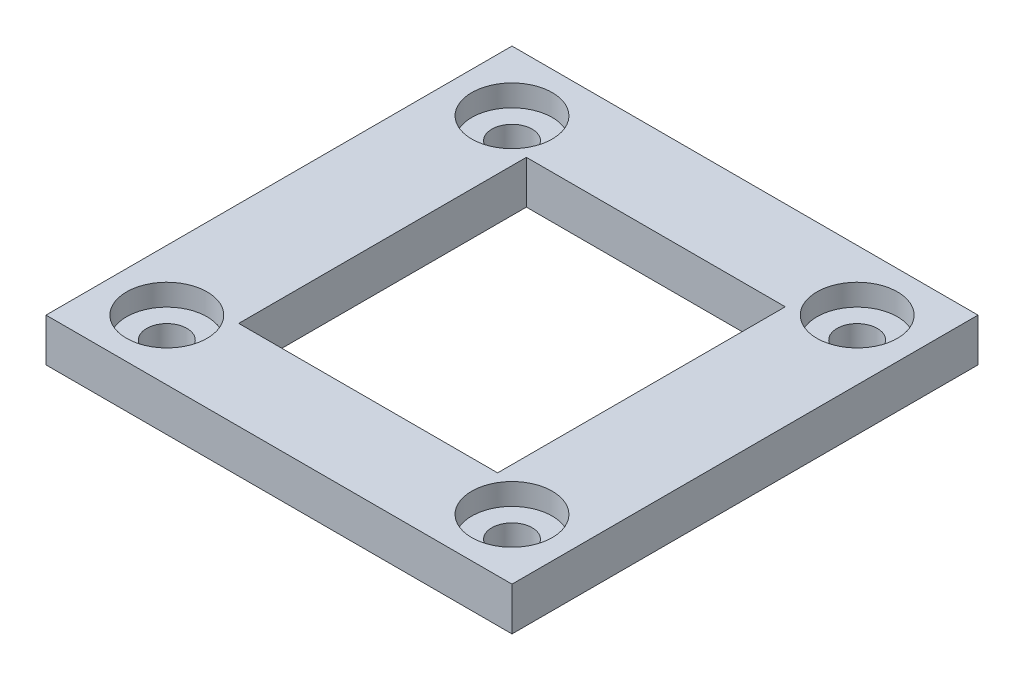
ISO-10303-21;
HEADER;
FILE_DESCRIPTION(('STEP AP214'),'2;1');
FILE_NAME('part.step','',(''),(''),'','','');
FILE_SCHEMA(('AUTOMOTIVE_DESIGN { 1 0 10303 214 1 1 1 1 }'));
ENDSEC;
DATA;
#1=APPLICATION_CONTEXT('core data for automotive mechanical design processes');
#2=APPLICATION_PROTOCOL_DEFINITION('international standard','automotive_design',2000,#1);
#3=PRODUCT_CONTEXT('',#1,'mechanical');
#4=PRODUCT('Part','Part','',(#3));
#5=PRODUCT_RELATED_PRODUCT_CATEGORY('part','',(#4));
#6=PRODUCT_DEFINITION_FORMATION('','',#4);
#7=PRODUCT_DEFINITION_CONTEXT('part definition',#1,'design');
#8=PRODUCT_DEFINITION('design','',#6,#7);
#9=PRODUCT_DEFINITION_SHAPE('','',#8);
#10=(LENGTH_UNIT() NAMED_UNIT(*) SI_UNIT(.MILLI.,.METRE.));
#11=(NAMED_UNIT(*) PLANE_ANGLE_UNIT() SI_UNIT($,.RADIAN.));
#12=(NAMED_UNIT(*) SI_UNIT($,.STERADIAN.) SOLID_ANGLE_UNIT());
#13=UNCERTAINTY_MEASURE_WITH_UNIT(LENGTH_MEASURE(1.E-05),#10,'distance_accuracy_value','');
#14=(GEOMETRIC_REPRESENTATION_CONTEXT(3) GLOBAL_UNCERTAINTY_ASSIGNED_CONTEXT((#13)) GLOBAL_UNIT_ASSIGNED_CONTEXT((#10,
#11,#12)) REPRESENTATION_CONTEXT('',''));
#15=CARTESIAN_POINT('',(0.,0.,0.));
#16=DIRECTION('',(0.,0.,1.));
#17=DIRECTION('',(1.,0.,0.));
#18=AXIS2_PLACEMENT_3D('',#15,#16,#17);
#19=CARTESIAN_POINT('',(0.,3.,0.));
#20=DIRECTION('',(0.,-1.,0.));
#21=DIRECTION('',(0.,0.,-1.));
#22=AXIS2_PLACEMENT_3D('',#19,#20,#21);
#23=PLANE('',#22);
#24=CARTESIAN_POINT('',(4.2,3.,-4.2));
#25=DIRECTION('',(0.,1.,0.));
#26=DIRECTION('',(0.,0.,1.));
#27=AXIS2_PLACEMENT_3D('',#24,#25,#26);
#28=CIRCLE('',#27,2.8);
#29=CARTESIAN_POINT('',(4.2,3.,-1.4));
#30=VERTEX_POINT('',#29);
#31=EDGE_CURVE('E170',#30,#30,#28,.T.);
#32=ORIENTED_EDGE('',*,*,#31,.F.);
#33=EDGE_LOOP('',(#32));
#34=FACE_BOUND('',#33,.T.);
#35=DIRECTION('',(0.,0.,1.));
#36=VECTOR('',#35,1.);
#37=CARTESIAN_POINT('',(0.,3.,0.));
#38=LINE('',#37,#36);
#39=CARTESIAN_POINT('',(0.,3.,-32.4));
#40=VERTEX_POINT('',#39);
#41=CARTESIAN_POINT('',(0.,3.,0.));
#42=VERTEX_POINT('',#41);
#43=EDGE_CURVE('E183',#40,#42,#38,.T.);
#44=ORIENTED_EDGE('',*,*,#43,.T.);
#45=DIRECTION('',(1.,0.,0.));
#46=VECTOR('',#45,1.);
#47=CARTESIAN_POINT('',(0.,3.,0.));
#48=LINE('',#47,#46);
#49=CARTESIAN_POINT('',(32.4,3.,0.));
#50=VERTEX_POINT('',#49);
#51=EDGE_CURVE('E186',#42,#50,#48,.T.);
#52=ORIENTED_EDGE('',*,*,#51,.T.);
#53=DIRECTION('',(0.,0.,-1.));
#54=VECTOR('',#53,1.);
#55=CARTESIAN_POINT('',(32.4,3.,0.));
#56=LINE('',#55,#54);
#57=CARTESIAN_POINT('',(32.4,3.,-32.4));
#58=VERTEX_POINT('',#57);
#59=EDGE_CURVE('E189',#50,#58,#56,.T.);
#60=ORIENTED_EDGE('',*,*,#59,.T.);
#61=DIRECTION('',(-1.,0.,0.));
#62=VECTOR('',#61,1.);
#63=CARTESIAN_POINT('',(0.,3.,-32.4));
#64=LINE('',#63,#62);
#65=EDGE_CURVE('E191',#58,#40,#64,.T.);
#66=ORIENTED_EDGE('',*,*,#65,.T.);
#67=EDGE_LOOP('',(#44,#52,#60,#66));
#68=FACE_BOUND('',#67,.T.);
#69=CARTESIAN_POINT('',(28.2,3.,-4.2));
#70=DIRECTION('',(0.,1.,0.));
#71=DIRECTION('',(0.,0.,1.));
#72=AXIS2_PLACEMENT_3D('',#69,#70,#71);
#73=CIRCLE('',#72,2.8);
#74=CARTESIAN_POINT('',(28.2,3.,-1.4));
#75=VERTEX_POINT('',#74);
#76=EDGE_CURVE('E158',#75,#75,#73,.T.);
#77=ORIENTED_EDGE('',*,*,#76,.F.);
#78=EDGE_LOOP('',(#77));
#79=FACE_BOUND('',#78,.T.);
#80=CARTESIAN_POINT('',(28.2,3.,-28.2));
#81=DIRECTION('',(0.,1.,0.));
#82=DIRECTION('',(0.,0.,1.));
#83=AXIS2_PLACEMENT_3D('',#80,#81,#82);
#84=CIRCLE('',#83,2.8);
#85=CARTESIAN_POINT('',(28.2,3.,-25.4));
#86=VERTEX_POINT('',#85);
#87=EDGE_CURVE('E146',#86,#86,#84,.T.);
#88=ORIENTED_EDGE('',*,*,#87,.F.);
#89=EDGE_LOOP('',(#88));
#90=FACE_BOUND('',#89,.T.);
#91=CARTESIAN_POINT('',(4.2,3.,-28.2));
#92=DIRECTION('',(0.,1.,0.));
#93=DIRECTION('',(0.,0.,1.));
#94=AXIS2_PLACEMENT_3D('',#91,#92,#93);
#95=CIRCLE('',#94,2.8);
#96=CARTESIAN_POINT('',(4.2,3.,-25.4));
#97=VERTEX_POINT('',#96);
#98=EDGE_CURVE('E131',#97,#97,#95,.T.);
#99=ORIENTED_EDGE('',*,*,#98,.F.);
#100=EDGE_LOOP('',(#99));
#101=FACE_BOUND('',#100,.T.);
#102=DIRECTION('',(0.,0.,-1.));
#103=VECTOR('',#102,1.);
#104=CARTESIAN_POINT('',(7.2,3.,0.));
#105=LINE('',#104,#103);
#106=CARTESIAN_POINT('',(7.2,3.,-6.2));
#107=VERTEX_POINT('',#106);
#108=CARTESIAN_POINT('',(7.2,3.,-26.2));
#109=VERTEX_POINT('',#108);
#110=EDGE_CURVE('E49',#107,#109,#105,.T.);
#111=ORIENTED_EDGE('',*,*,#110,.T.);
#112=DIRECTION('',(-1.,0.,0.));
#113=VECTOR('',#112,1.);
#114=CARTESIAN_POINT('',(0.,3.,-26.2));
#115=LINE('',#114,#113);
#116=CARTESIAN_POINT('',(25.2,3.,-26.2));
#117=VERTEX_POINT('',#116);
#118=EDGE_CURVE('E116',#117,#109,#115,.T.);
#119=ORIENTED_EDGE('',*,*,#118,.F.);
#120=DIRECTION('',(0.,0.,-1.));
#121=VECTOR('',#120,1.);
#122=CARTESIAN_POINT('',(25.2,3.,0.));
#123=LINE('',#122,#121);
#124=CARTESIAN_POINT('',(25.2,3.,-6.2));
#125=VERTEX_POINT('',#124);
#126=EDGE_CURVE('E119',#125,#117,#123,.T.);
#127=ORIENTED_EDGE('',*,*,#126,.F.);
#128=DIRECTION('',(-1.,0.,0.));
#129=VECTOR('',#128,1.);
#130=CARTESIAN_POINT('',(0.,3.,-6.2));
#131=LINE('',#130,#129);
#132=EDGE_CURVE('E125',#125,#107,#131,.T.);
#133=ORIENTED_EDGE('',*,*,#132,.T.);
#134=EDGE_LOOP('',(#111,#119,#127,#133));
#135=FACE_BOUND('',#134,.T.);
#136=ADVANCED_FACE('F34',(#34,#68,#79,#90,#101,#135),#23,.F.);
#137=CARTESIAN_POINT('',(0.,0.,0.));
#138=DIRECTION('',(0.,-1.,0.));
#139=DIRECTION('',(0.,0.,-1.));
#140=AXIS2_PLACEMENT_3D('',#137,#138,#139);
#141=PLANE('',#140);
#142=CARTESIAN_POINT('',(4.2,0.,-28.2));
#143=DIRECTION('',(0.,1.,0.));
#144=DIRECTION('',(0.,0.,1.));
#145=AXIS2_PLACEMENT_3D('',#142,#143,#144);
#146=CIRCLE('',#145,1.4);
#147=CARTESIAN_POINT('',(4.2,0.,-26.8));
#148=VERTEX_POINT('',#147);
#149=EDGE_CURVE('E143',#148,#148,#146,.T.);
#150=ORIENTED_EDGE('',*,*,#149,.T.);
#151=EDGE_LOOP('',(#150));
#152=FACE_BOUND('',#151,.T.);
#153=CARTESIAN_POINT('',(28.2,0.,-28.2));
#154=DIRECTION('',(0.,1.,0.));
#155=DIRECTION('',(0.,0.,1.));
#156=AXIS2_PLACEMENT_3D('',#153,#154,#155);
#157=CIRCLE('',#156,1.4);
#158=CARTESIAN_POINT('',(28.2,0.,-26.8));
#159=VERTEX_POINT('',#158);
#160=EDGE_CURVE('E155',#159,#159,#157,.T.);
#161=ORIENTED_EDGE('',*,*,#160,.T.);
#162=EDGE_LOOP('',(#161));
#163=FACE_BOUND('',#162,.T.);
#164=CARTESIAN_POINT('',(28.2,0.,-4.2));
#165=DIRECTION('',(0.,1.,0.));
#166=DIRECTION('',(0.,0.,1.));
#167=AXIS2_PLACEMENT_3D('',#164,#165,#166);
#168=CIRCLE('',#167,1.4);
#169=CARTESIAN_POINT('',(28.2,0.,-2.8));
#170=VERTEX_POINT('',#169);
#171=EDGE_CURVE('E167',#170,#170,#168,.T.);
#172=ORIENTED_EDGE('',*,*,#171,.T.);
#173=EDGE_LOOP('',(#172));
#174=FACE_BOUND('',#173,.T.);
#175=CARTESIAN_POINT('',(4.2,0.,-4.2));
#176=DIRECTION('',(0.,1.,0.));
#177=DIRECTION('',(0.,0.,1.));
#178=AXIS2_PLACEMENT_3D('',#175,#176,#177);
#179=CIRCLE('',#178,1.4);
#180=CARTESIAN_POINT('',(4.2,0.,-2.8));
#181=VERTEX_POINT('',#180);
#182=EDGE_CURVE('E179',#181,#181,#179,.T.);
#183=ORIENTED_EDGE('',*,*,#182,.T.);
#184=EDGE_LOOP('',(#183));
#185=FACE_BOUND('',#184,.T.);
#186=DIRECTION('',(0.,0.,1.));
#187=VECTOR('',#186,1.);
#188=CARTESIAN_POINT('',(0.,0.,0.));
#189=LINE('',#188,#187);
#190=CARTESIAN_POINT('',(0.,0.,-32.4));
#191=VERTEX_POINT('',#190);
#192=CARTESIAN_POINT('',(0.,0.,0.));
#193=VERTEX_POINT('',#192);
#194=EDGE_CURVE('E182',#191,#193,#189,.T.);
#195=ORIENTED_EDGE('',*,*,#194,.F.);
#196=DIRECTION('',(-1.,0.,0.));
#197=VECTOR('',#196,1.);
#198=CARTESIAN_POINT('',(0.,0.,-32.4));
#199=LINE('',#198,#197);
#200=CARTESIAN_POINT('',(32.4,0.,-32.4));
#201=VERTEX_POINT('',#200);
#202=EDGE_CURVE('E187',#201,#191,#199,.T.);
#203=ORIENTED_EDGE('',*,*,#202,.F.);
#204=DIRECTION('',(0.,0.,-1.));
#205=VECTOR('',#204,1.);
#206=CARTESIAN_POINT('',(32.4,0.,0.));
#207=LINE('',#206,#205);
#208=CARTESIAN_POINT('',(32.4,0.,0.));
#209=VERTEX_POINT('',#208);
#210=EDGE_CURVE('E198',#209,#201,#207,.T.);
#211=ORIENTED_EDGE('',*,*,#210,.F.);
#212=DIRECTION('',(1.,0.,0.));
#213=VECTOR('',#212,1.);
#214=CARTESIAN_POINT('',(0.,0.,0.));
#215=LINE('',#214,#213);
#216=EDGE_CURVE('E196',#193,#209,#215,.T.);
#217=ORIENTED_EDGE('',*,*,#216,.F.);
#218=EDGE_LOOP('',(#195,#203,#211,#217));
#219=FACE_BOUND('',#218,.T.);
#220=DIRECTION('',(-1.,0.,0.));
#221=VECTOR('',#220,1.);
#222=CARTESIAN_POINT('',(0.,0.,-26.2));
#223=LINE('',#222,#221);
#224=CARTESIAN_POINT('',(25.2,0.,-26.2));
#225=VERTEX_POINT('',#224);
#226=CARTESIAN_POINT('',(7.2,0.,-26.2));
#227=VERTEX_POINT('',#226);
#228=EDGE_CURVE('E111',#225,#227,#223,.T.);
#229=ORIENTED_EDGE('',*,*,#228,.T.);
#230=DIRECTION('',(0.,0.,-1.));
#231=VECTOR('',#230,1.);
#232=CARTESIAN_POINT('',(7.2,0.,0.));
#233=LINE('',#232,#231);
#234=CARTESIAN_POINT('',(7.2,0.,-6.2));
#235=VERTEX_POINT('',#234);
#236=EDGE_CURVE('E107',#235,#227,#233,.T.);
#237=ORIENTED_EDGE('',*,*,#236,.F.);
#238=DIRECTION('',(-1.,0.,0.));
#239=VECTOR('',#238,1.);
#240=CARTESIAN_POINT('',(0.,0.,-6.2));
#241=LINE('',#240,#239);
#242=CARTESIAN_POINT('',(25.2,0.,-6.2));
#243=VERTEX_POINT('',#242);
#244=EDGE_CURVE('E99',#243,#235,#241,.T.);
#245=ORIENTED_EDGE('',*,*,#244,.F.);
#246=DIRECTION('',(0.,0.,-1.));
#247=VECTOR('',#246,1.);
#248=CARTESIAN_POINT('',(25.2,0.,0.));
#249=LINE('',#248,#247);
#250=EDGE_CURVE('E57',#243,#225,#249,.T.);
#251=ORIENTED_EDGE('',*,*,#250,.T.);
#252=EDGE_LOOP('',(#229,#237,#245,#251));
#253=FACE_BOUND('',#252,.T.);
#254=ADVANCED_FACE('F114',(#152,#163,#174,#185,#219,#253),#141,.T.);
#255=CARTESIAN_POINT('',(0.,3.,0.));
#256=DIRECTION('',(1.,0.,0.));
#257=DIRECTION('',(0.,0.,-1.));
#258=AXIS2_PLACEMENT_3D('',#255,#256,#257);
#259=PLANE('',#258);
#260=ORIENTED_EDGE('',*,*,#194,.T.);
#261=DIRECTION('',(0.,-1.,0.));
#262=VECTOR('',#261,1.);
#263=CARTESIAN_POINT('',(0.,3.,0.));
#264=LINE('',#263,#262);
#265=EDGE_CURVE('E11',#42,#193,#264,.T.);
#266=ORIENTED_EDGE('',*,*,#265,.F.);
#267=ORIENTED_EDGE('',*,*,#43,.F.);
#268=DIRECTION('',(0.,-1.,0.));
#269=VECTOR('',#268,1.);
#270=CARTESIAN_POINT('',(0.,3.,-32.4));
#271=LINE('',#270,#269);
#272=EDGE_CURVE('E193',#40,#191,#271,.T.);
#273=ORIENTED_EDGE('',*,*,#272,.T.);
#274=EDGE_LOOP('',(#260,#266,#267,#273));
#275=FACE_BOUND('',#274,.T.);
#276=ADVANCED_FACE('F36',(#275),#259,.F.);
#277=CARTESIAN_POINT('',(0.,3.,0.));
#278=DIRECTION('',(0.,0.,-1.));
#279=DIRECTION('',(-1.,0.,0.));
#280=AXIS2_PLACEMENT_3D('',#277,#278,#279);
#281=PLANE('',#280);
#282=ORIENTED_EDGE('',*,*,#216,.T.);
#283=DIRECTION('',(0.,-1.,0.));
#284=VECTOR('',#283,1.);
#285=CARTESIAN_POINT('',(32.4,3.,0.));
#286=LINE('',#285,#284);
#287=EDGE_CURVE('E42',#50,#209,#286,.T.);
#288=ORIENTED_EDGE('',*,*,#287,.F.);
#289=ORIENTED_EDGE('',*,*,#51,.F.);
#290=ORIENTED_EDGE('',*,*,#265,.T.);
#291=EDGE_LOOP('',(#282,#288,#289,#290));
#292=FACE_BOUND('',#291,.T.);
#293=ADVANCED_FACE('F225',(#292),#281,.F.);
#294=CARTESIAN_POINT('',(32.4,3.,0.));
#295=DIRECTION('',(-1.,0.,0.));
#296=DIRECTION('',(0.,0.,1.));
#297=AXIS2_PLACEMENT_3D('',#294,#295,#296);
#298=PLANE('',#297);
#299=ORIENTED_EDGE('',*,*,#210,.T.);
#300=DIRECTION('',(0.,-1.,0.));
#301=VECTOR('',#300,1.);
#302=CARTESIAN_POINT('',(32.4,3.,-32.4));
#303=LINE('',#302,#301);
#304=EDGE_CURVE('E203',#58,#201,#303,.T.);
#305=ORIENTED_EDGE('',*,*,#304,.F.);
#306=ORIENTED_EDGE('',*,*,#59,.F.);
#307=ORIENTED_EDGE('',*,*,#287,.T.);
#308=EDGE_LOOP('',(#299,#305,#306,#307));
#309=FACE_BOUND('',#308,.T.);
#310=ADVANCED_FACE('F210',(#309),#298,.F.);
#311=CARTESIAN_POINT('',(0.,3.,-32.4));
#312=DIRECTION('',(0.,0.,1.));
#313=DIRECTION('',(1.,0.,0.));
#314=AXIS2_PLACEMENT_3D('',#311,#312,#313);
#315=PLANE('',#314);
#316=ORIENTED_EDGE('',*,*,#202,.T.);
#317=ORIENTED_EDGE('',*,*,#272,.F.);
#318=ORIENTED_EDGE('',*,*,#65,.F.);
#319=ORIENTED_EDGE('',*,*,#304,.T.);
#320=EDGE_LOOP('',(#316,#317,#318,#319));
#321=FACE_BOUND('',#320,.T.);
#322=ADVANCED_FACE('F218',(#321),#315,.F.);
#323=CARTESIAN_POINT('',(4.2,3.,-4.2));
#324=DIRECTION('',(0.,1.,0.));
#325=DIRECTION('',(0.,0.,1.));
#326=AXIS2_PLACEMENT_3D('',#323,#324,#325);
#327=CYLINDRICAL_SURFACE('',#326,1.4);
#328=ORIENTED_EDGE('',*,*,#182,.F.);
#329=EDGE_LOOP('',(#328));
#330=FACE_BOUND('',#329,.T.);
#331=CARTESIAN_POINT('',(4.2,1.5,-4.2));
#332=DIRECTION('',(0.,1.,0.));
#333=DIRECTION('',(0.,0.,1.));
#334=AXIS2_PLACEMENT_3D('',#331,#332,#333);
#335=CIRCLE('',#334,1.4);
#336=CARTESIAN_POINT('',(4.2,1.5,-2.8));
#337=VERTEX_POINT('',#336);
#338=EDGE_CURVE('E176',#337,#337,#335,.T.);
#339=ORIENTED_EDGE('',*,*,#338,.T.);
#340=EDGE_LOOP('',(#339));
#341=FACE_BOUND('',#340,.T.);
#342=ADVANCED_FACE('F242',(#330,#341),#327,.F.);
#343=CARTESIAN_POINT('',(5.6,1.5,-4.2));
#344=DIRECTION('',(0.,-1.,0.));
#345=DIRECTION('',(0.,0.,-1.));
#346=AXIS2_PLACEMENT_3D('',#343,#344,#345);
#347=PLANE('',#346);
#348=ORIENTED_EDGE('',*,*,#338,.F.);
#349=EDGE_LOOP('',(#348));
#350=FACE_BOUND('',#349,.T.);
#351=CARTESIAN_POINT('',(4.2,1.5,-4.2));
#352=DIRECTION('',(0.,1.,0.));
#353=DIRECTION('',(0.,0.,1.));
#354=AXIS2_PLACEMENT_3D('',#351,#352,#353);
#355=CIRCLE('',#354,2.8);
#356=CARTESIAN_POINT('',(4.2,1.5,-1.4));
#357=VERTEX_POINT('',#356);
#358=EDGE_CURVE('E173',#357,#357,#355,.T.);
#359=ORIENTED_EDGE('',*,*,#358,.T.);
#360=EDGE_LOOP('',(#359));
#361=FACE_BOUND('',#360,.T.);
#362=ADVANCED_FACE('F249',(#350,#361),#347,.F.);
#363=CARTESIAN_POINT('',(4.2,3.,-4.2));
#364=DIRECTION('',(0.,1.,0.));
#365=DIRECTION('',(0.,0.,1.));
#366=AXIS2_PLACEMENT_3D('',#363,#364,#365);
#367=CYLINDRICAL_SURFACE('',#366,2.8);
#368=ORIENTED_EDGE('',*,*,#358,.F.);
#369=EDGE_LOOP('',(#368));
#370=FACE_BOUND('',#369,.T.);
#371=ORIENTED_EDGE('',*,*,#31,.T.);
#372=EDGE_LOOP('',(#371));
#373=FACE_BOUND('',#372,.T.);
#374=ADVANCED_FACE('F254',(#370,#373),#367,.F.);
#375=CARTESIAN_POINT('',(28.2,3.,-4.2));
#376=DIRECTION('',(0.,1.,0.));
#377=DIRECTION('',(0.,0.,1.));
#378=AXIS2_PLACEMENT_3D('',#375,#376,#377);
#379=CYLINDRICAL_SURFACE('',#378,1.4);
#380=ORIENTED_EDGE('',*,*,#171,.F.);
#381=EDGE_LOOP('',(#380));
#382=FACE_BOUND('',#381,.T.);
#383=CARTESIAN_POINT('',(28.2,1.5,-4.2));
#384=DIRECTION('',(0.,1.,0.));
#385=DIRECTION('',(0.,0.,1.));
#386=AXIS2_PLACEMENT_3D('',#383,#384,#385);
#387=CIRCLE('',#386,1.4);
#388=CARTESIAN_POINT('',(28.2,1.5,-2.8));
#389=VERTEX_POINT('',#388);
#390=EDGE_CURVE('E164',#389,#389,#387,.T.);
#391=ORIENTED_EDGE('',*,*,#390,.T.);
#392=EDGE_LOOP('',(#391));
#393=FACE_BOUND('',#392,.T.);
#394=ADVANCED_FACE('F264',(#382,#393),#379,.F.);
#395=CARTESIAN_POINT('',(29.6,1.5,-4.2));
#396=DIRECTION('',(0.,-1.,0.));
#397=DIRECTION('',(0.,0.,-1.));
#398=AXIS2_PLACEMENT_3D('',#395,#396,#397);
#399=PLANE('',#398);
#400=ORIENTED_EDGE('',*,*,#390,.F.);
#401=EDGE_LOOP('',(#400));
#402=FACE_BOUND('',#401,.T.);
#403=CARTESIAN_POINT('',(28.2,1.5,-4.2));
#404=DIRECTION('',(0.,1.,0.));
#405=DIRECTION('',(0.,0.,1.));
#406=AXIS2_PLACEMENT_3D('',#403,#404,#405);
#407=CIRCLE('',#406,2.8);
#408=CARTESIAN_POINT('',(28.2,1.5,-1.4));
#409=VERTEX_POINT('',#408);
#410=EDGE_CURVE('E161',#409,#409,#407,.T.);
#411=ORIENTED_EDGE('',*,*,#410,.T.);
#412=EDGE_LOOP('',(#411));
#413=FACE_BOUND('',#412,.T.);
#414=ADVANCED_FACE('F269',(#402,#413),#399,.F.);
#415=CARTESIAN_POINT('',(28.2,3.,-4.2));
#416=DIRECTION('',(0.,1.,0.));
#417=DIRECTION('',(0.,0.,1.));
#418=AXIS2_PLACEMENT_3D('',#415,#416,#417);
#419=CYLINDRICAL_SURFACE('',#418,2.8);
#420=ORIENTED_EDGE('',*,*,#410,.F.);
#421=EDGE_LOOP('',(#420));
#422=FACE_BOUND('',#421,.T.);
#423=ORIENTED_EDGE('',*,*,#76,.T.);
#424=EDGE_LOOP('',(#423));
#425=FACE_BOUND('',#424,.T.);
#426=ADVANCED_FACE('F275',(#422,#425),#419,.F.);
#427=CARTESIAN_POINT('',(28.2,3.,-28.2));
#428=DIRECTION('',(0.,1.,0.));
#429=DIRECTION('',(0.,0.,1.));
#430=AXIS2_PLACEMENT_3D('',#427,#428,#429);
#431=CYLINDRICAL_SURFACE('',#430,1.4);
#432=ORIENTED_EDGE('',*,*,#160,.F.);
#433=EDGE_LOOP('',(#432));
#434=FACE_BOUND('',#433,.T.);
#435=CARTESIAN_POINT('',(28.2,1.5,-28.2));
#436=DIRECTION('',(0.,1.,0.));
#437=DIRECTION('',(0.,0.,1.));
#438=AXIS2_PLACEMENT_3D('',#435,#436,#437);
#439=CIRCLE('',#438,1.4);
#440=CARTESIAN_POINT('',(28.2,1.5,-26.8));
#441=VERTEX_POINT('',#440);
#442=EDGE_CURVE('E152',#441,#441,#439,.T.);
#443=ORIENTED_EDGE('',*,*,#442,.T.);
#444=EDGE_LOOP('',(#443));
#445=FACE_BOUND('',#444,.T.);
#446=ADVANCED_FACE('F279',(#434,#445),#431,.F.);
#447=CARTESIAN_POINT('',(29.6,1.5,-28.2));
#448=DIRECTION('',(0.,-1.,0.));
#449=DIRECTION('',(0.,0.,-1.));
#450=AXIS2_PLACEMENT_3D('',#447,#448,#449);
#451=PLANE('',#450);
#452=ORIENTED_EDGE('',*,*,#442,.F.);
#453=EDGE_LOOP('',(#452));
#454=FACE_BOUND('',#453,.T.);
#455=CARTESIAN_POINT('',(28.2,1.5,-28.2));
#456=DIRECTION('',(0.,1.,0.));
#457=DIRECTION('',(0.,0.,1.));
#458=AXIS2_PLACEMENT_3D('',#455,#456,#457);
#459=CIRCLE('',#458,2.8);
#460=CARTESIAN_POINT('',(28.2,1.5,-25.4));
#461=VERTEX_POINT('',#460);
#462=EDGE_CURVE('E149',#461,#461,#459,.T.);
#463=ORIENTED_EDGE('',*,*,#462,.T.);
#464=EDGE_LOOP('',(#463));
#465=FACE_BOUND('',#464,.T.);
#466=ADVANCED_FACE('F283',(#454,#465),#451,.F.);
#467=CARTESIAN_POINT('',(28.2,3.,-28.2));
#468=DIRECTION('',(0.,1.,0.));
#469=DIRECTION('',(0.,0.,1.));
#470=AXIS2_PLACEMENT_3D('',#467,#468,#469);
#471=CYLINDRICAL_SURFACE('',#470,2.8);
#472=ORIENTED_EDGE('',*,*,#462,.F.);
#473=EDGE_LOOP('',(#472));
#474=FACE_BOUND('',#473,.T.);
#475=ORIENTED_EDGE('',*,*,#87,.T.);
#476=EDGE_LOOP('',(#475));
#477=FACE_BOUND('',#476,.T.);
#478=ADVANCED_FACE('F287',(#474,#477),#471,.F.);
#479=CARTESIAN_POINT('',(4.2,3.,-28.2));
#480=DIRECTION('',(0.,1.,0.));
#481=DIRECTION('',(0.,0.,1.));
#482=AXIS2_PLACEMENT_3D('',#479,#480,#481);
#483=CYLINDRICAL_SURFACE('',#482,1.4);
#484=ORIENTED_EDGE('',*,*,#149,.F.);
#485=EDGE_LOOP('',(#484));
#486=FACE_BOUND('',#485,.T.);
#487=CARTESIAN_POINT('',(4.2,1.5,-28.2));
#488=DIRECTION('',(0.,1.,0.));
#489=DIRECTION('',(0.,0.,1.));
#490=AXIS2_PLACEMENT_3D('',#487,#488,#489);
#491=CIRCLE('',#490,1.4);
#492=CARTESIAN_POINT('',(4.2,1.5,-26.8));
#493=VERTEX_POINT('',#492);
#494=EDGE_CURVE('E140',#493,#493,#491,.T.);
#495=ORIENTED_EDGE('',*,*,#494,.T.);
#496=EDGE_LOOP('',(#495));
#497=FACE_BOUND('',#496,.T.);
#498=ADVANCED_FACE('F291',(#486,#497),#483,.F.);
#499=CARTESIAN_POINT('',(5.6,1.5,-28.2));
#500=DIRECTION('',(0.,-1.,0.));
#501=DIRECTION('',(0.,0.,-1.));
#502=AXIS2_PLACEMENT_3D('',#499,#500,#501);
#503=PLANE('',#502);
#504=ORIENTED_EDGE('',*,*,#494,.F.);
#505=EDGE_LOOP('',(#504));
#506=FACE_BOUND('',#505,.T.);
#507=CARTESIAN_POINT('',(4.2,1.5,-28.2));
#508=DIRECTION('',(0.,1.,0.));
#509=DIRECTION('',(0.,0.,1.));
#510=AXIS2_PLACEMENT_3D('',#507,#508,#509);
#511=CIRCLE('',#510,2.8);
#512=CARTESIAN_POINT('',(4.2,1.5,-25.4));
#513=VERTEX_POINT('',#512);
#514=EDGE_CURVE('E137',#513,#513,#511,.T.);
#515=ORIENTED_EDGE('',*,*,#514,.T.);
#516=EDGE_LOOP('',(#515));
#517=FACE_BOUND('',#516,.T.);
#518=ADVANCED_FACE('F295',(#506,#517),#503,.F.);
#519=CARTESIAN_POINT('',(4.2,3.,-28.2));
#520=DIRECTION('',(0.,1.,0.));
#521=DIRECTION('',(0.,0.,1.));
#522=AXIS2_PLACEMENT_3D('',#519,#520,#521);
#523=CYLINDRICAL_SURFACE('',#522,2.8);
#524=ORIENTED_EDGE('',*,*,#514,.F.);
#525=EDGE_LOOP('',(#524));
#526=FACE_BOUND('',#525,.T.);
#527=ORIENTED_EDGE('',*,*,#98,.T.);
#528=EDGE_LOOP('',(#527));
#529=FACE_BOUND('',#528,.T.);
#530=ADVANCED_FACE('F299',(#526,#529),#523,.F.);
#531=CARTESIAN_POINT('',(7.2,0.,0.));
#532=DIRECTION('',(1.,0.,0.));
#533=DIRECTION('',(0.,0.,-1.));
#534=AXIS2_PLACEMENT_3D('',#531,#532,#533);
#535=PLANE('',#534);
#536=ORIENTED_EDGE('',*,*,#110,.F.);
#537=DIRECTION('',(0.,1.,0.));
#538=VECTOR('',#537,1.);
#539=CARTESIAN_POINT('',(7.2,0.,-6.2));
#540=LINE('',#539,#538);
#541=EDGE_CURVE('E102',#235,#107,#540,.T.);
#542=ORIENTED_EDGE('',*,*,#541,.F.);
#543=ORIENTED_EDGE('',*,*,#236,.T.);
#544=DIRECTION('',(0.,1.,0.));
#545=VECTOR('',#544,1.);
#546=CARTESIAN_POINT('',(7.2,0.,-26.2));
#547=LINE('',#546,#545);
#548=EDGE_CURVE('E129',#227,#109,#547,.T.);
#549=ORIENTED_EDGE('',*,*,#548,.T.);
#550=EDGE_LOOP('',(#536,#542,#543,#549));
#551=FACE_BOUND('',#550,.T.);
#552=ADVANCED_FACE('F109',(#551),#535,.T.);
#553=CARTESIAN_POINT('',(0.,0.,-26.2));
#554=DIRECTION('',(0.,0.,-1.));
#555=DIRECTION('',(-1.,0.,0.));
#556=AXIS2_PLACEMENT_3D('',#553,#554,#555);
#557=PLANE('',#556);
#558=ORIENTED_EDGE('',*,*,#118,.T.);
#559=ORIENTED_EDGE('',*,*,#548,.F.);
#560=ORIENTED_EDGE('',*,*,#228,.F.);
#561=DIRECTION('',(0.,1.,0.));
#562=VECTOR('',#561,1.);
#563=CARTESIAN_POINT('',(25.2,0.,-26.2));
#564=LINE('',#563,#562);
#565=EDGE_CURVE('E132',#225,#117,#564,.T.);
#566=ORIENTED_EDGE('',*,*,#565,.T.);
#567=EDGE_LOOP('',(#558,#559,#560,#566));
#568=FACE_BOUND('',#567,.T.);
#569=ADVANCED_FACE('F306',(#568),#557,.F.);
#570=CARTESIAN_POINT('',(25.2,0.,0.));
#571=DIRECTION('',(1.,0.,0.));
#572=DIRECTION('',(0.,0.,-1.));
#573=AXIS2_PLACEMENT_3D('',#570,#571,#572);
#574=PLANE('',#573);
#575=ORIENTED_EDGE('',*,*,#126,.T.);
#576=ORIENTED_EDGE('',*,*,#565,.F.);
#577=ORIENTED_EDGE('',*,*,#250,.F.);
#578=DIRECTION('',(0.,1.,0.));
#579=VECTOR('',#578,1.);
#580=CARTESIAN_POINT('',(25.2,0.,-6.2));
#581=LINE('',#580,#579);
#582=EDGE_CURVE('E104',#243,#125,#581,.T.);
#583=ORIENTED_EDGE('',*,*,#582,.T.);
#584=EDGE_LOOP('',(#575,#576,#577,#583));
#585=FACE_BOUND('',#584,.T.);
#586=ADVANCED_FACE('F309',(#585),#574,.F.);
#587=CARTESIAN_POINT('',(0.,0.,-6.2));
#588=DIRECTION('',(0.,0.,-1.));
#589=DIRECTION('',(-1.,0.,0.));
#590=AXIS2_PLACEMENT_3D('',#587,#588,#589);
#591=PLANE('',#590);
#592=ORIENTED_EDGE('',*,*,#132,.F.);
#593=ORIENTED_EDGE('',*,*,#582,.F.);
#594=ORIENTED_EDGE('',*,*,#244,.T.);
#595=ORIENTED_EDGE('',*,*,#541,.T.);
#596=EDGE_LOOP('',(#592,#593,#594,#595));
#597=FACE_BOUND('',#596,.T.);
#598=ADVANCED_FACE('F101',(#597),#591,.T.);
#599=CLOSED_SHELL('',(#136,#254,#276,#293,#310,#322,#342,#362,#374,#394,#414,#426,#446,#466,
#478,#498,#518,#530,#552,#569,#586,#598));
#600=MANIFOLD_SOLID_BREP('B2',#599);
#601=ADVANCED_BREP_SHAPE_REPRESENTATION('',(#18,#600),#14);
#602=SHAPE_DEFINITION_REPRESENTATION(#9,#601);
ENDSEC;
END-ISO-10303-21;
